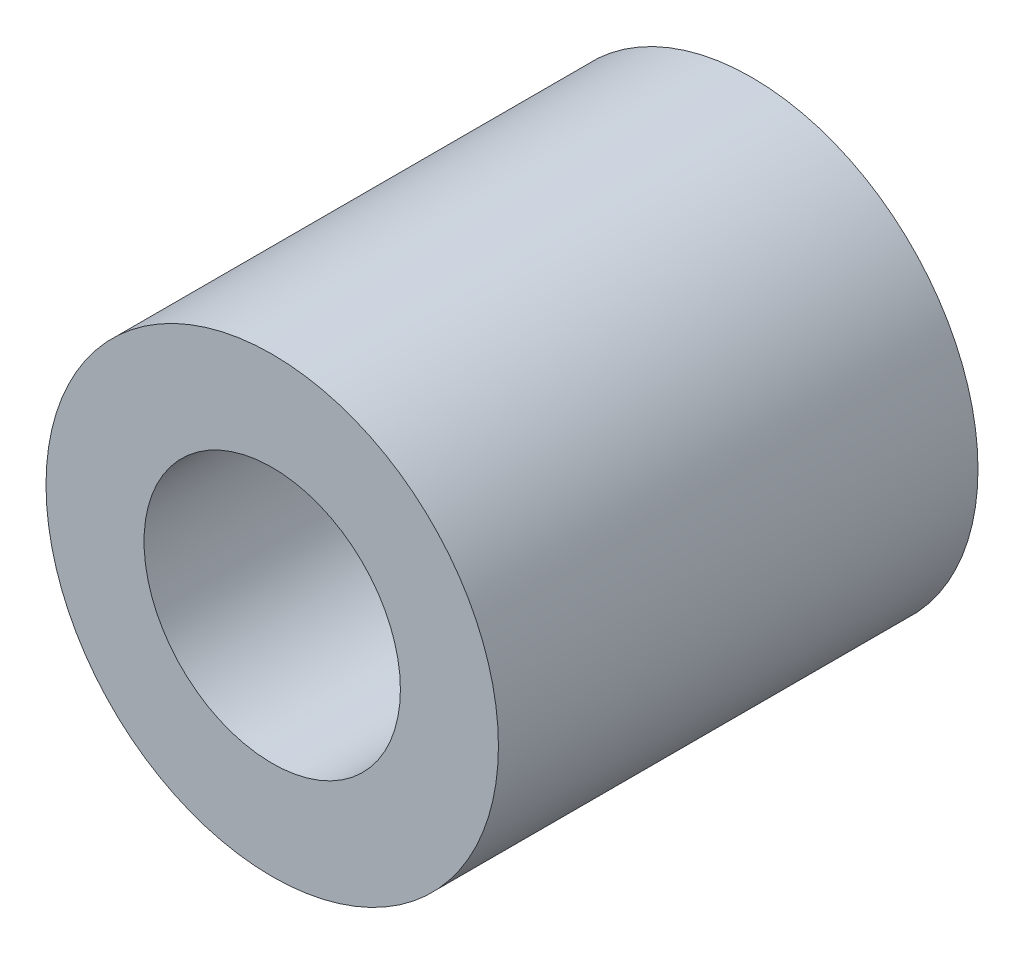
ISO-10303-21;
HEADER;
FILE_DESCRIPTION(('STEP AP214'),'2;1');
FILE_NAME('part.step','',(''),(''),'','','');
FILE_SCHEMA(('AUTOMOTIVE_DESIGN { 1 0 10303 214 1 1 1 1 }'));
ENDSEC;
DATA;
#1=APPLICATION_CONTEXT('core data for automotive mechanical design processes');
#2=APPLICATION_PROTOCOL_DEFINITION('international standard','automotive_design',2000,#1);
#3=PRODUCT_CONTEXT('',#1,'mechanical');
#4=PRODUCT('Part','Part','',(#3));
#5=PRODUCT_RELATED_PRODUCT_CATEGORY('part','',(#4));
#6=PRODUCT_DEFINITION_FORMATION('','',#4);
#7=PRODUCT_DEFINITION_CONTEXT('part definition',#1,'design');
#8=PRODUCT_DEFINITION('design','',#6,#7);
#9=PRODUCT_DEFINITION_SHAPE('','',#8);
#10=(LENGTH_UNIT() NAMED_UNIT(*) SI_UNIT(.MILLI.,.METRE.));
#11=(NAMED_UNIT(*) PLANE_ANGLE_UNIT() SI_UNIT($,.RADIAN.));
#12=(NAMED_UNIT(*) SI_UNIT($,.STERADIAN.) SOLID_ANGLE_UNIT());
#13=UNCERTAINTY_MEASURE_WITH_UNIT(LENGTH_MEASURE(1.E-05),#10,'distance_accuracy_value','');
#14=(GEOMETRIC_REPRESENTATION_CONTEXT(3) GLOBAL_UNCERTAINTY_ASSIGNED_CONTEXT((#13)) GLOBAL_UNIT_ASSIGNED_CONTEXT((#10,
#11,#12)) REPRESENTATION_CONTEXT('',''));
#15=CARTESIAN_POINT('',(0.,0.,0.));
#16=DIRECTION('',(0.,0.,1.));
#17=DIRECTION('',(1.,0.,0.));
#18=AXIS2_PLACEMENT_3D('',#15,#16,#17);
#19=CARTESIAN_POINT('',(0.,0.,15.9));
#20=DIRECTION('',(0.,0.,1.));
#21=DIRECTION('',(1.,0.,0.));
#22=AXIS2_PLACEMENT_3D('',#19,#20,#21);
#23=PLANE('',#22);
#24=CARTESIAN_POINT('',(0.,0.,15.9));
#25=DIRECTION('',(0.,0.,1.));
#26=DIRECTION('',(1.,0.,0.));
#27=AXIS2_PLACEMENT_3D('',#24,#25,#26);
#28=CIRCLE('',#27,7.5);
#29=CARTESIAN_POINT('',(7.5,0.,15.9));
#30=VERTEX_POINT('',#29);
#31=EDGE_CURVE('E10',#30,#30,#28,.T.);
#32=ORIENTED_EDGE('',*,*,#31,.T.);
#33=EDGE_LOOP('',(#32));
#34=FACE_BOUND('',#33,.T.);
#35=CARTESIAN_POINT('',(0.,0.,15.9));
#36=DIRECTION('',(0.,0.,1.));
#37=DIRECTION('',(1.,0.,0.));
#38=AXIS2_PLACEMENT_3D('',#35,#36,#37);
#39=CIRCLE('',#38,4.25);
#40=CARTESIAN_POINT('',(4.25,0.,15.9));
#41=VERTEX_POINT('',#40);
#42=EDGE_CURVE('E42',#41,#41,#39,.T.);
#43=ORIENTED_EDGE('',*,*,#42,.F.);
#44=EDGE_LOOP('',(#43));
#45=FACE_BOUND('',#44,.T.);
#46=ADVANCED_FACE('F31',(#34,#45),#23,.T.);
#47=CARTESIAN_POINT('',(0.,0.,0.));
#48=DIRECTION('',(0.,0.,1.));
#49=DIRECTION('',(1.,0.,0.));
#50=AXIS2_PLACEMENT_3D('',#47,#48,#49);
#51=PLANE('',#50);
#52=CARTESIAN_POINT('',(0.,0.,0.));
#53=DIRECTION('',(0.,0.,1.));
#54=DIRECTION('',(1.,0.,0.));
#55=AXIS2_PLACEMENT_3D('',#52,#53,#54);
#56=CIRCLE('',#55,7.5);
#57=CARTESIAN_POINT('',(7.5,0.,0.));
#58=VERTEX_POINT('',#57);
#59=EDGE_CURVE('E35',#58,#58,#56,.T.);
#60=ORIENTED_EDGE('',*,*,#59,.F.);
#61=EDGE_LOOP('',(#60));
#62=FACE_BOUND('',#61,.T.);
#63=CARTESIAN_POINT('',(0.,0.,0.));
#64=DIRECTION('',(0.,0.,1.));
#65=DIRECTION('',(1.,0.,0.));
#66=AXIS2_PLACEMENT_3D('',#63,#64,#65);
#67=CIRCLE('',#66,4.25);
#68=CARTESIAN_POINT('',(4.25,0.,0.));
#69=VERTEX_POINT('',#68);
#70=EDGE_CURVE('E44',#69,#69,#67,.T.);
#71=ORIENTED_EDGE('',*,*,#70,.T.);
#72=EDGE_LOOP('',(#71));
#73=FACE_BOUND('',#72,.T.);
#74=ADVANCED_FACE('F54',(#62,#73),#51,.F.);
#75=CARTESIAN_POINT('',(0.,0.,15.9));
#76=DIRECTION('',(0.,0.,-1.));
#77=DIRECTION('',(-1.,0.,0.));
#78=AXIS2_PLACEMENT_3D('',#75,#76,#77);
#79=CYLINDRICAL_SURFACE('',#78,7.5);
#80=ORIENTED_EDGE('',*,*,#31,.F.);
#81=EDGE_LOOP('',(#80));
#82=FACE_BOUND('',#81,.T.);
#83=ORIENTED_EDGE('',*,*,#59,.T.);
#84=EDGE_LOOP('',(#83));
#85=FACE_BOUND('',#84,.T.);
#86=ADVANCED_FACE('F33',(#82,#85),#79,.T.);
#87=CARTESIAN_POINT('',(0.,0.,15.9));
#88=DIRECTION('',(0.,0.,-1.));
#89=DIRECTION('',(-1.,0.,0.));
#90=AXIS2_PLACEMENT_3D('',#87,#88,#89);
#91=CYLINDRICAL_SURFACE('',#90,4.25);
#92=ORIENTED_EDGE('',*,*,#42,.T.);
#93=EDGE_LOOP('',(#92));
#94=FACE_BOUND('',#93,.T.);
#95=ORIENTED_EDGE('',*,*,#70,.F.);
#96=EDGE_LOOP('',(#95));
#97=FACE_BOUND('',#96,.T.);
#98=ADVANCED_FACE('F50',(#94,#97),#91,.F.);
#99=CLOSED_SHELL('',(#46,#74,#86,#98));
#100=MANIFOLD_SOLID_BREP('B2',#99);
#101=ADVANCED_BREP_SHAPE_REPRESENTATION('',(#18,#100),#14);
#102=SHAPE_DEFINITION_REPRESENTATION(#9,#101);
ENDSEC;
END-ISO-10303-21;
